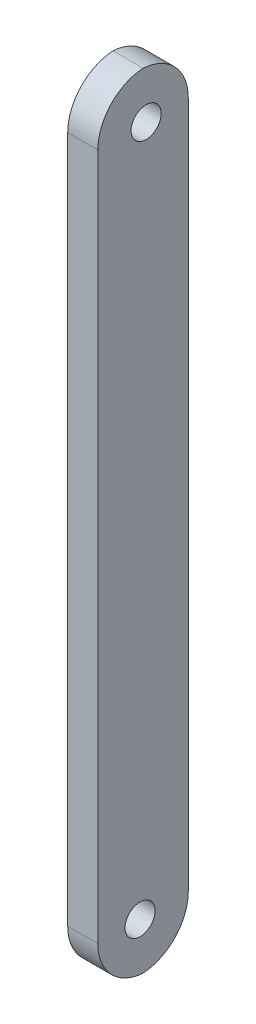
ISO-10303-21;
HEADER;
FILE_DESCRIPTION(('STEP AP214'),'2;1');
FILE_NAME('part.step','',(''),(''),'','','');
FILE_SCHEMA(('AUTOMOTIVE_DESIGN { 1 0 10303 214 1 1 1 1 }'));
ENDSEC;
DATA;
#1=APPLICATION_CONTEXT('core data for automotive mechanical design processes');
#2=APPLICATION_PROTOCOL_DEFINITION('international standard','automotive_design',2000,#1);
#3=PRODUCT_CONTEXT('',#1,'mechanical');
#4=PRODUCT('Part','Part','',(#3));
#5=PRODUCT_RELATED_PRODUCT_CATEGORY('part','',(#4));
#6=PRODUCT_DEFINITION_FORMATION('','',#4);
#7=PRODUCT_DEFINITION_CONTEXT('part definition',#1,'design');
#8=PRODUCT_DEFINITION('design','',#6,#7);
#9=PRODUCT_DEFINITION_SHAPE('','',#8);
#10=(LENGTH_UNIT() NAMED_UNIT(*) SI_UNIT(.MILLI.,.METRE.));
#11=(NAMED_UNIT(*) PLANE_ANGLE_UNIT() SI_UNIT($,.RADIAN.));
#12=(NAMED_UNIT(*) SI_UNIT($,.STERADIAN.) SOLID_ANGLE_UNIT());
#13=UNCERTAINTY_MEASURE_WITH_UNIT(LENGTH_MEASURE(1.E-05),#10,'distance_accuracy_value','');
#14=(GEOMETRIC_REPRESENTATION_CONTEXT(3) GLOBAL_UNCERTAINTY_ASSIGNED_CONTEXT((#13)) GLOBAL_UNIT_ASSIGNED_CONTEXT((#10,
#11,#12)) REPRESENTATION_CONTEXT('',''));
#15=CARTESIAN_POINT('',(0.,0.,0.));
#16=DIRECTION('',(0.,0.,1.));
#17=DIRECTION('',(1.,0.,0.));
#18=AXIS2_PLACEMENT_3D('',#15,#16,#17);
#19=CARTESIAN_POINT('',(0.,0.,15.));
#20=DIRECTION('',(1.,0.,0.));
#21=DIRECTION('',(0.,0.,-1.));
#22=AXIS2_PLACEMENT_3D('',#19,#20,#21);
#23=PLANE('',#22);
#24=CARTESIAN_POINT('',(0.,8.,8.));
#25=DIRECTION('',(1.,0.,0.));
#26=DIRECTION('',(0.,0.,-1.));
#27=AXIS2_PLACEMENT_3D('',#24,#25,#26);
#28=CIRCLE('',#27,2.5);
#29=CARTESIAN_POINT('',(0.,8.,5.5));
#30=VERTEX_POINT('',#29);
#31=EDGE_CURVE('E131',#30,#30,#28,.T.);
#32=ORIENTED_EDGE('',*,*,#31,.T.);
#33=EDGE_LOOP('',(#32));
#34=FACE_BOUND('',#33,.T.);
#35=CARTESIAN_POINT('',(0.,122.,7.));
#36=DIRECTION('',(1.,0.,0.));
#37=DIRECTION('',(0.,0.,-1.));
#38=AXIS2_PLACEMENT_3D('',#35,#36,#37);
#39=CIRCLE('',#38,2.5);
#40=CARTESIAN_POINT('',(0.,122.,4.5));
#41=VERTEX_POINT('',#40);
#42=EDGE_CURVE('E123',#41,#41,#39,.T.);
#43=ORIENTED_EDGE('',*,*,#42,.T.);
#44=EDGE_LOOP('',(#43));
#45=FACE_BOUND('',#44,.T.);
#46=CARTESIAN_POINT('',(0.,8.,8.));
#47=DIRECTION('',(1.,0.,0.));
#48=DIRECTION('',(0.,0.,-1.));
#49=AXIS2_PLACEMENT_3D('',#46,#47,#48);
#50=CIRCLE('',#49,8.);
#51=CARTESIAN_POINT('',(0.,8.,0.));
#52=VERTEX_POINT('',#51);
#53=CARTESIAN_POINT('',(0.,0.015640288664345,7.5));
#54=VERTEX_POINT('',#53);
#55=EDGE_CURVE('E51',#52,#54,#50,.F.);
#56=ORIENTED_EDGE('',*,*,#55,.T.);
#57=CARTESIAN_POINT('',(0.,8.,7.));
#58=DIRECTION('',(1.,0.,0.));
#59=DIRECTION('',(0.,0.,-1.));
#60=AXIS2_PLACEMENT_3D('',#57,#58,#59);
#61=CIRCLE('',#60,8.);
#62=CARTESIAN_POINT('',(0.,8.,15.));
#63=VERTEX_POINT('',#62);
#64=EDGE_CURVE('E102',#54,#63,#61,.F.);
#65=ORIENTED_EDGE('',*,*,#64,.T.);
#66=DIRECTION('',(0.,-1.,0.));
#67=VECTOR('',#66,1.);
#68=CARTESIAN_POINT('',(0.,0.,15.));
#69=LINE('',#68,#67);
#70=CARTESIAN_POINT('',(0.,122.,15.));
#71=VERTEX_POINT('',#70);
#72=EDGE_CURVE('E93',#71,#63,#69,.T.);
#73=ORIENTED_EDGE('',*,*,#72,.F.);
#74=CARTESIAN_POINT('',(0.,122.,7.));
#75=DIRECTION('',(1.,0.,0.));
#76=DIRECTION('',(0.,0.,-1.));
#77=AXIS2_PLACEMENT_3D('',#74,#75,#76);
#78=CIRCLE('',#77,8.);
#79=CARTESIAN_POINT('',(0.,129.984359711336,7.5));
#80=VERTEX_POINT('',#79);
#81=EDGE_CURVE('E58',#71,#80,#78,.F.);
#82=ORIENTED_EDGE('',*,*,#81,.T.);
#83=CARTESIAN_POINT('',(0.,122.,8.));
#84=DIRECTION('',(1.,0.,0.));
#85=DIRECTION('',(0.,0.,-1.));
#86=AXIS2_PLACEMENT_3D('',#83,#84,#85);
#87=CIRCLE('',#86,8.);
#88=CARTESIAN_POINT('',(0.,122.,0.));
#89=VERTEX_POINT('',#88);
#90=EDGE_CURVE('E107',#80,#89,#87,.F.);
#91=ORIENTED_EDGE('',*,*,#90,.T.);
#92=DIRECTION('',(0.,-1.,0.));
#93=VECTOR('',#92,1.);
#94=CARTESIAN_POINT('',(0.,0.,0.));
#95=LINE('',#94,#93);
#96=EDGE_CURVE('E120',#89,#52,#95,.T.);
#97=ORIENTED_EDGE('',*,*,#96,.T.);
#98=EDGE_LOOP('',(#56,#65,#73,#82,#91,#97));
#99=FACE_BOUND('',#98,.T.);
#100=ADVANCED_FACE('F34',(#34,#45,#99),#23,.F.);
#101=CARTESIAN_POINT('',(5.,0.,15.));
#102=DIRECTION('',(-1.,0.,0.));
#103=DIRECTION('',(0.,-1.,0.));
#104=AXIS2_PLACEMENT_3D('',#101,#102,#103);
#105=PLANE('',#104);
#106=CARTESIAN_POINT('',(5.,8.,8.));
#107=DIRECTION('',(1.,0.,0.));
#108=DIRECTION('',(0.,0.,-1.));
#109=AXIS2_PLACEMENT_3D('',#106,#107,#108);
#110=CIRCLE('',#109,2.5);
#111=CARTESIAN_POINT('',(5.,8.,5.5));
#112=VERTEX_POINT('',#111);
#113=EDGE_CURVE('E193',#112,#112,#110,.T.);
#114=ORIENTED_EDGE('',*,*,#113,.F.);
#115=EDGE_LOOP('',(#114));
#116=FACE_BOUND('',#115,.T.);
#117=CARTESIAN_POINT('',(5.,122.,7.));
#118=DIRECTION('',(1.,0.,0.));
#119=DIRECTION('',(0.,0.,-1.));
#120=AXIS2_PLACEMENT_3D('',#117,#118,#119);
#121=CIRCLE('',#120,2.5);
#122=CARTESIAN_POINT('',(5.,122.,4.5));
#123=VERTEX_POINT('',#122);
#124=EDGE_CURVE('E126',#123,#123,#121,.T.);
#125=ORIENTED_EDGE('',*,*,#124,.F.);
#126=EDGE_LOOP('',(#125));
#127=FACE_BOUND('',#126,.T.);
#128=DIRECTION('',(0.,1.,0.));
#129=VECTOR('',#128,1.);
#130=CARTESIAN_POINT('',(5.,0.,15.));
#131=LINE('',#130,#129);
#132=CARTESIAN_POINT('',(5.,8.,15.));
#133=VERTEX_POINT('',#132);
#134=CARTESIAN_POINT('',(5.,122.,15.));
#135=VERTEX_POINT('',#134);
#136=EDGE_CURVE('E96',#133,#135,#131,.T.);
#137=ORIENTED_EDGE('',*,*,#136,.F.);
#138=CARTESIAN_POINT('',(5.,8.,7.));
#139=DIRECTION('',(-1.,0.,0.));
#140=DIRECTION('',(0.,-1.,0.));
#141=AXIS2_PLACEMENT_3D('',#138,#139,#140);
#142=CIRCLE('',#141,8.);
#143=CARTESIAN_POINT('',(5.,0.015640288664345,7.5));
#144=VERTEX_POINT('',#143);
#145=EDGE_CURVE('E108',#133,#144,#142,.F.);
#146=ORIENTED_EDGE('',*,*,#145,.T.);
#147=CARTESIAN_POINT('',(5.,8.,8.));
#148=DIRECTION('',(-1.,0.,0.));
#149=DIRECTION('',(0.,-1.,0.));
#150=AXIS2_PLACEMENT_3D('',#147,#148,#149);
#151=CIRCLE('',#150,8.);
#152=CARTESIAN_POINT('',(5.,8.,0.));
#153=VERTEX_POINT('',#152);
#154=EDGE_CURVE('E111',#144,#153,#151,.F.);
#155=ORIENTED_EDGE('',*,*,#154,.T.);
#156=DIRECTION('',(0.,1.,0.));
#157=VECTOR('',#156,1.);
#158=CARTESIAN_POINT('',(5.,0.,0.));
#159=LINE('',#158,#157);
#160=CARTESIAN_POINT('',(5.,122.,0.));
#161=VERTEX_POINT('',#160);
#162=EDGE_CURVE('E103',#153,#161,#159,.T.);
#163=ORIENTED_EDGE('',*,*,#162,.T.);
#164=CARTESIAN_POINT('',(5.,122.,8.));
#165=DIRECTION('',(-1.,0.,0.));
#166=DIRECTION('',(0.,-1.,0.));
#167=AXIS2_PLACEMENT_3D('',#164,#165,#166);
#168=CIRCLE('',#167,8.);
#169=CARTESIAN_POINT('',(5.,129.984359711336,7.5));
#170=VERTEX_POINT('',#169);
#171=EDGE_CURVE('E141',#161,#170,#168,.F.);
#172=ORIENTED_EDGE('',*,*,#171,.T.);
#173=CARTESIAN_POINT('',(5.,122.,7.));
#174=DIRECTION('',(-1.,0.,0.));
#175=DIRECTION('',(0.,-1.,0.));
#176=AXIS2_PLACEMENT_3D('',#173,#174,#175);
#177=CIRCLE('',#176,8.);
#178=EDGE_CURVE('E139',#170,#135,#177,.F.);
#179=ORIENTED_EDGE('',*,*,#178,.T.);
#180=EDGE_LOOP('',(#137,#146,#155,#163,#172,#179));
#181=FACE_BOUND('',#180,.T.);
#182=ADVANCED_FACE('F145',(#116,#127,#181),#105,.F.);
#183=CARTESIAN_POINT('',(0.,0.,15.));
#184=DIRECTION('',(0.,0.,-1.));
#185=DIRECTION('',(-1.,0.,0.));
#186=AXIS2_PLACEMENT_3D('',#183,#184,#185);
#187=PLANE('',#186);
#188=ORIENTED_EDGE('',*,*,#72,.T.);
#189=DIRECTION('',(1.,0.,0.));
#190=VECTOR('',#189,1.);
#191=CARTESIAN_POINT('',(0.,8.,15.));
#192=LINE('',#191,#190);
#193=EDGE_CURVE('E99',#63,#133,#192,.T.);
#194=ORIENTED_EDGE('',*,*,#193,.T.);
#195=ORIENTED_EDGE('',*,*,#136,.T.);
#196=DIRECTION('',(-1.,0.,0.));
#197=VECTOR('',#196,1.);
#198=CARTESIAN_POINT('',(0.,122.,15.));
#199=LINE('',#198,#197);
#200=EDGE_CURVE('E90',#135,#71,#199,.T.);
#201=ORIENTED_EDGE('',*,*,#200,.T.);
#202=EDGE_LOOP('',(#188,#194,#195,#201));
#203=FACE_BOUND('',#202,.T.);
#204=ADVANCED_FACE('F91',(#203),#187,.F.);
#205=CARTESIAN_POINT('',(0.,0.,0.));
#206=DIRECTION('',(0.,0.,-1.));
#207=DIRECTION('',(-1.,0.,0.));
#208=AXIS2_PLACEMENT_3D('',#205,#206,#207);
#209=PLANE('',#208);
#210=ORIENTED_EDGE('',*,*,#162,.F.);
#211=DIRECTION('',(1.,0.,0.));
#212=VECTOR('',#211,1.);
#213=CARTESIAN_POINT('',(0.,8.,0.));
#214=LINE('',#213,#212);
#215=EDGE_CURVE('E11',#153,#52,#214,.F.);
#216=ORIENTED_EDGE('',*,*,#215,.T.);
#217=ORIENTED_EDGE('',*,*,#96,.F.);
#218=DIRECTION('',(-1.,0.,0.));
#219=VECTOR('',#218,1.);
#220=CARTESIAN_POINT('',(5.,122.,0.));
#221=LINE('',#220,#219);
#222=EDGE_CURVE('E43',#89,#161,#221,.F.);
#223=ORIENTED_EDGE('',*,*,#222,.T.);
#224=EDGE_LOOP('',(#210,#216,#217,#223));
#225=FACE_BOUND('',#224,.T.);
#226=ADVANCED_FACE('F149',(#225),#209,.T.);
#227=CARTESIAN_POINT('',(0.,8.,8.));
#228=DIRECTION('',(-1.,0.,0.));
#229=DIRECTION('',(0.,0.,1.));
#230=AXIS2_PLACEMENT_3D('',#227,#228,#229);
#231=CYLINDRICAL_SURFACE('',#230,8.);
#232=DIRECTION('',(-1.,0.,0.));
#233=VECTOR('',#232,1.);
#234=CARTESIAN_POINT('',(2.5,0.015640288664345,7.5));
#235=LINE('',#234,#233);
#236=EDGE_CURVE('E118',#54,#144,#235,.F.);
#237=ORIENTED_EDGE('',*,*,#236,.F.);
#238=ORIENTED_EDGE('',*,*,#55,.F.);
#239=ORIENTED_EDGE('',*,*,#215,.F.);
#240=ORIENTED_EDGE('',*,*,#154,.F.);
#241=EDGE_LOOP('',(#237,#238,#239,#240));
#242=FACE_BOUND('',#241,.T.);
#243=ADVANCED_FACE('F152',(#242),#231,.T.);
#244=CARTESIAN_POINT('',(0.,8.,7.));
#245=DIRECTION('',(1.,0.,0.));
#246=DIRECTION('',(0.,0.,-1.));
#247=AXIS2_PLACEMENT_3D('',#244,#245,#246);
#248=CYLINDRICAL_SURFACE('',#247,8.);
#249=ORIENTED_EDGE('',*,*,#64,.F.);
#250=ORIENTED_EDGE('',*,*,#236,.T.);
#251=ORIENTED_EDGE('',*,*,#145,.F.);
#252=ORIENTED_EDGE('',*,*,#193,.F.);
#253=EDGE_LOOP('',(#249,#250,#251,#252));
#254=FACE_BOUND('',#253,.T.);
#255=ADVANCED_FACE('F153',(#254),#248,.T.);
#256=CARTESIAN_POINT('',(0.,122.,7.));
#257=DIRECTION('',(-1.,0.,0.));
#258=DIRECTION('',(0.,0.,1.));
#259=AXIS2_PLACEMENT_3D('',#256,#257,#258);
#260=CYLINDRICAL_SURFACE('',#259,8.);
#261=ORIENTED_EDGE('',*,*,#200,.F.);
#262=ORIENTED_EDGE('',*,*,#178,.F.);
#263=DIRECTION('',(-1.,0.,0.));
#264=VECTOR('',#263,1.);
#265=CARTESIAN_POINT('',(2.5,129.984359711336,7.5));
#266=LINE('',#265,#264);
#267=EDGE_CURVE('E38',#80,#170,#266,.F.);
#268=ORIENTED_EDGE('',*,*,#267,.F.);
#269=ORIENTED_EDGE('',*,*,#81,.F.);
#270=EDGE_LOOP('',(#261,#262,#268,#269));
#271=FACE_BOUND('',#270,.T.);
#272=ADVANCED_FACE('F36',(#271),#260,.T.);
#273=CARTESIAN_POINT('',(0.,122.,8.));
#274=DIRECTION('',(1.,0.,0.));
#275=DIRECTION('',(0.,0.,-1.));
#276=AXIS2_PLACEMENT_3D('',#273,#274,#275);
#277=CYLINDRICAL_SURFACE('',#276,8.);
#278=ORIENTED_EDGE('',*,*,#171,.F.);
#279=ORIENTED_EDGE('',*,*,#222,.F.);
#280=ORIENTED_EDGE('',*,*,#90,.F.);
#281=ORIENTED_EDGE('',*,*,#267,.T.);
#282=EDGE_LOOP('',(#278,#279,#280,#281));
#283=FACE_BOUND('',#282,.T.);
#284=ADVANCED_FACE('F154',(#283),#277,.T.);
#285=CARTESIAN_POINT('',(-10.,122.,7.));
#286=DIRECTION('',(1.,0.,0.));
#287=DIRECTION('',(0.,0.,-1.));
#288=AXIS2_PLACEMENT_3D('',#285,#286,#287);
#289=CYLINDRICAL_SURFACE('',#288,2.5);
#290=ORIENTED_EDGE('',*,*,#124,.T.);
#291=EDGE_LOOP('',(#290));
#292=FACE_BOUND('',#291,.T.);
#293=ORIENTED_EDGE('',*,*,#42,.F.);
#294=EDGE_LOOP('',(#293));
#295=FACE_BOUND('',#294,.T.);
#296=ADVANCED_FACE('F156',(#292,#295),#289,.F.);
#297=CARTESIAN_POINT('',(-10.,8.,8.));
#298=DIRECTION('',(1.,0.,0.));
#299=DIRECTION('',(0.,0.,-1.));
#300=AXIS2_PLACEMENT_3D('',#297,#298,#299);
#301=CYLINDRICAL_SURFACE('',#300,2.5);
#302=ORIENTED_EDGE('',*,*,#113,.T.);
#303=EDGE_LOOP('',(#302));
#304=FACE_BOUND('',#303,.T.);
#305=ORIENTED_EDGE('',*,*,#31,.F.);
#306=EDGE_LOOP('',(#305));
#307=FACE_BOUND('',#306,.T.);
#308=ADVANCED_FACE('F161',(#304,#307),#301,.F.);
#309=CLOSED_SHELL('',(#100,#182,#204,#226,#243,#255,#272,#284,#296,#308));
#310=MANIFOLD_SOLID_BREP('B2',#309);
#311=ADVANCED_BREP_SHAPE_REPRESENTATION('',(#18,#310),#14);
#312=SHAPE_DEFINITION_REPRESENTATION(#9,#311);
ENDSEC;
END-ISO-10303-21;
